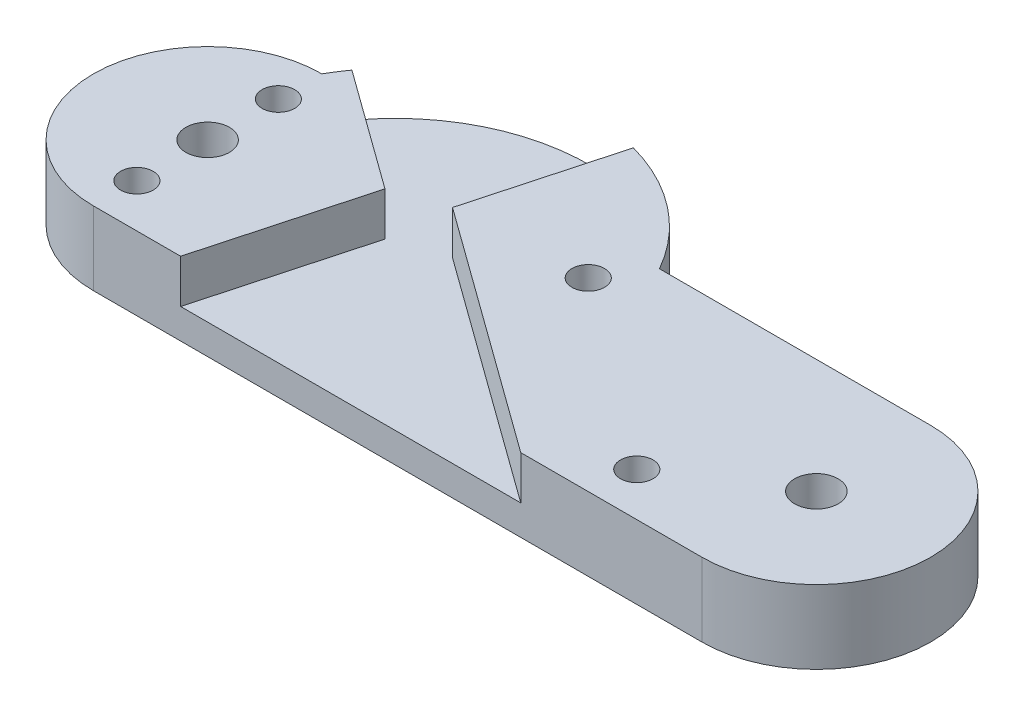
ISO-10303-21;
HEADER;
FILE_DESCRIPTION(('STEP AP214'),'2;1');
FILE_NAME('part.step','',(''),(''),'','','');
FILE_SCHEMA(('AUTOMOTIVE_DESIGN { 1 0 10303 214 1 1 1 1 }'));
ENDSEC;
DATA;
#1=APPLICATION_CONTEXT('core data for automotive mechanical design processes');
#2=APPLICATION_PROTOCOL_DEFINITION('international standard','automotive_design',2000,#1);
#3=PRODUCT_CONTEXT('',#1,'mechanical');
#4=PRODUCT('Part','Part','',(#3));
#5=PRODUCT_RELATED_PRODUCT_CATEGORY('part','',(#4));
#6=PRODUCT_DEFINITION_FORMATION('','',#4);
#7=PRODUCT_DEFINITION_CONTEXT('part definition',#1,'design');
#8=PRODUCT_DEFINITION('design','',#6,#7);
#9=PRODUCT_DEFINITION_SHAPE('','',#8);
#10=(LENGTH_UNIT() NAMED_UNIT(*) SI_UNIT(.MILLI.,.METRE.));
#11=(NAMED_UNIT(*) PLANE_ANGLE_UNIT() SI_UNIT($,.RADIAN.));
#12=(NAMED_UNIT(*) SI_UNIT($,.STERADIAN.) SOLID_ANGLE_UNIT());
#13=UNCERTAINTY_MEASURE_WITH_UNIT(LENGTH_MEASURE(1.E-05),#10,'distance_accuracy_value','');
#14=(GEOMETRIC_REPRESENTATION_CONTEXT(3) GLOBAL_UNCERTAINTY_ASSIGNED_CONTEXT((#13)) GLOBAL_UNIT_ASSIGNED_CONTEXT((#10,
#11,#12)) REPRESENTATION_CONTEXT('',''));
#15=CARTESIAN_POINT('',(0.,0.,0.));
#16=DIRECTION('',(0.,0.,1.));
#17=DIRECTION('',(1.,0.,0.));
#18=AXIS2_PLACEMENT_3D('',#15,#16,#17);
#19=CARTESIAN_POINT('',(0.,2.,0.));
#20=DIRECTION('',(0.,-1.,0.));
#21=DIRECTION('',(0.,0.,-1.));
#22=AXIS2_PLACEMENT_3D('',#19,#20,#21);
#23=PLANE('',#22);
#24=CARTESIAN_POINT('',(-55.9305382801715,2.,-6.5003992165423));
#25=DIRECTION('',(0.,-1.,0.));
#26=DIRECTION('',(0.,0.,-1.));
#27=AXIS2_PLACEMENT_3D('',#24,#25,#26);
#28=CIRCLE('',#27,1.5);
#29=CARTESIAN_POINT('',(-55.9305382801715,2.,-8.00039921654231));
#30=VERTEX_POINT('',#29);
#31=EDGE_CURVE('E196',#30,#30,#28,.F.);
#32=ORIENTED_EDGE('',*,*,#31,.F.);
#33=EDGE_LOOP('',(#32));
#34=FACE_BOUND('',#33,.T.);
#35=CARTESIAN_POINT('',(-55.9305382801715,2.,0.));
#36=DIRECTION('',(0.,-1.,0.));
#37=DIRECTION('',(0.,0.,-1.));
#38=AXIS2_PLACEMENT_3D('',#35,#36,#37);
#39=CIRCLE('',#38,2.);
#40=CARTESIAN_POINT('',(-55.9305382801715,2.,-2.));
#41=VERTEX_POINT('',#40);
#42=EDGE_CURVE('E11',#41,#41,#39,.T.);
#43=ORIENTED_EDGE('',*,*,#42,.T.);
#44=EDGE_LOOP('',(#43));
#45=FACE_BOUND('',#44,.T.);
#46=CARTESIAN_POINT('',(-55.9305382801715,2.,0.));
#47=DIRECTION('',(0.,-1.,0.));
#48=DIRECTION('',(0.,0.,-1.));
#49=AXIS2_PLACEMENT_3D('',#46,#47,#48);
#50=CIRCLE('',#49,10.5003992165423);
#51=CARTESIAN_POINT('',(-55.9305382801715,2.,10.5003992165423));
#52=VERTEX_POINT('',#51);
#53=CARTESIAN_POINT('',(-55.9305382801715,2.,-10.5003992165423));
#54=VERTEX_POINT('',#53);
#55=EDGE_CURVE('E167',#52,#54,#50,.T.);
#56=ORIENTED_EDGE('',*,*,#55,.F.);
#57=DIRECTION('',(-1.,0.,0.));
#58=VECTOR('',#57,1.);
#59=CARTESIAN_POINT('',(0.,2.,10.5003992165423));
#60=LINE('',#59,#58);
#61=CARTESIAN_POINT('',(-47.9106890267398,2.,10.5003992165423));
#62=VERTEX_POINT('',#61);
#63=EDGE_CURVE('E190',#62,#52,#60,.T.);
#64=ORIENTED_EDGE('',*,*,#63,.F.);
#65=DIRECTION('',(-0.263153614525289,0.,0.964753945398657));
#66=VECTOR('',#65,1.);
#67=CARTESIAN_POINT('',(-43.8872651072943,2.,-4.24997427651618));
#68=LINE('',#67,#66);
#69=CARTESIAN_POINT('',(-43.8872651072943,2.,-4.24997427651618));
#70=VERTEX_POINT('',#69);
#71=EDGE_CURVE('E533',#70,#62,#68,.T.);
#72=ORIENTED_EDGE('',*,*,#71,.F.);
#73=DIRECTION('',(0.810372315489383,0.,0.585915275691269));
#74=VECTOR('',#73,1.);
#75=CARTESIAN_POINT('',(-43.8872651072943,2.,-4.24997427651618));
#76=LINE('',#75,#74);
#77=CARTESIAN_POINT('',(-54.8543825263999,2.,-12.1794179449777));
#78=VERTEX_POINT('',#77);
#79=EDGE_CURVE('E550',#78,#70,#76,.T.);
#80=ORIENTED_EDGE('',*,*,#79,.F.);
#81=CARTESIAN_POINT('',(-40.4241193156667,2.,-1.7460511013579));
#82=DIRECTION('',(0.,-1.,0.));
#83=DIRECTION('',(0.,0.,-1.));
#84=AXIS2_PLACEMENT_3D('',#81,#82,#83);
#85=CIRCLE('',#84,17.8069548217708);
#86=EDGE_CURVE('E64',#54,#78,#85,.T.);
#87=ORIENTED_EDGE('',*,*,#86,.F.);
#88=EDGE_LOOP('',(#56,#64,#72,#80,#87));
#89=FACE_BOUND('',#88,.T.);
#90=CARTESIAN_POINT('',(-55.9305382801715,2.,6.5003992165423));
#91=DIRECTION('',(0.,-1.,0.));
#92=DIRECTION('',(0.,0.,-1.));
#93=AXIS2_PLACEMENT_3D('',#90,#91,#92);
#94=CIRCLE('',#93,1.5);
#95=CARTESIAN_POINT('',(-55.9305382801715,2.,5.0003992165423));
#96=VERTEX_POINT('',#95);
#97=EDGE_CURVE('E202',#96,#96,#94,.F.);
#98=ORIENTED_EDGE('',*,*,#97,.F.);
#99=EDGE_LOOP('',(#98));
#100=FACE_BOUND('',#99,.T.);
#101=ADVANCED_FACE('F40',(#34,#45,#89,#100),#23,.F.);
#102=CARTESIAN_POINT('',(-41.5933955268113,2.,-5.05946240908561));
#103=DIRECTION('',(0.,1.,0.));
#104=DIRECTION('',(0.,0.,1.));
#105=AXIS2_PLACEMENT_3D('',#102,#103,#104);
#106=PLANE('',#105);
#107=CARTESIAN_POINT('',(0.,2.,0.));
#108=DIRECTION('',(0.,1.,0.));
#109=DIRECTION('',(0.,0.,1.));
#110=AXIS2_PLACEMENT_3D('',#107,#108,#109);
#111=CIRCLE('',#110,2.);
#112=CARTESIAN_POINT('',(0.,2.,2.));
#113=VERTEX_POINT('',#112);
#114=EDGE_CURVE('E142',#113,#113,#111,.T.);
#115=ORIENTED_EDGE('',*,*,#114,.F.);
#116=EDGE_LOOP('',(#115));
#117=FACE_BOUND('',#116,.T.);
#118=DIRECTION('',(1.,0.,0.));
#119=VECTOR('',#118,1.);
#120=CARTESIAN_POINT('',(-12.458850175581,2.,-10.5003992165423));
#121=LINE('',#120,#119);
#122=CARTESIAN_POINT('',(-24.917700351162,2.,-10.5003992165423));
#123=VERTEX_POINT('',#122);
#124=CARTESIAN_POINT('',(0.,2.,-10.5003992165423));
#125=VERTEX_POINT('',#124);
#126=EDGE_CURVE('E56',#123,#125,#121,.T.);
#127=ORIENTED_EDGE('',*,*,#126,.F.);
#128=CARTESIAN_POINT('',(-35.7381547906292,2.,-18.9253810211969));
#129=VERTEX_POINT('',#128);
#130=EDGE_CURVE('E193',#129,#123,#85,.T.);
#131=ORIENTED_EDGE('',*,*,#130,.F.);
#132=DIRECTION('',(0.263153614525288,0.,-0.964753945398658));
#133=VECTOR('',#132,1.);
#134=CARTESIAN_POINT('',(-35.7518279113757,2.,-18.8752536565782));
#135=LINE('',#134,#133);
#136=CARTESIAN_POINT('',(-39.2995259463282,2.,-5.86895054165502));
#137=VERTEX_POINT('',#136);
#138=EDGE_CURVE('E547',#137,#129,#135,.T.);
#139=ORIENTED_EDGE('',*,*,#138,.F.);
#140=DIRECTION('',(-0.810372315489383,0.,-0.585915275691269));
#141=VECTOR('',#140,1.);
#142=CARTESIAN_POINT('',(26.6452391554762,2.,41.8104240945407));
#143=LINE('',#142,#141);
#144=CARTESIAN_POINT('',(-16.659276720951,2.,10.5003992165423));
#145=VERTEX_POINT('',#144);
#146=EDGE_CURVE('E528',#145,#137,#143,.T.);
#147=ORIENTED_EDGE('',*,*,#146,.F.);
#148=DIRECTION('',(-1.,0.,0.));
#149=VECTOR('',#148,1.);
#150=CARTESIAN_POINT('',(-4.6195471407067,2.,10.5003992165423));
#151=LINE('',#150,#149);
#152=CARTESIAN_POINT('',(0.,2.,10.5003992165423));
#153=VERTEX_POINT('',#152);
#154=EDGE_CURVE('E128',#153,#145,#151,.T.);
#155=ORIENTED_EDGE('',*,*,#154,.F.);
#156=CARTESIAN_POINT('',(0.,2.,0.));
#157=DIRECTION('',(0.,1.,0.));
#158=DIRECTION('',(0.,0.,1.));
#159=AXIS2_PLACEMENT_3D('',#156,#157,#158);
#160=CIRCLE('',#159,10.5003992165423);
#161=EDGE_CURVE('E124',#125,#153,#160,.F.);
#162=ORIENTED_EDGE('',*,*,#161,.F.);
#163=EDGE_LOOP('',(#127,#131,#139,#147,#155,#162));
#164=FACE_BOUND('',#163,.T.);
#165=CARTESIAN_POINT('',(-10.,2.,6.5003992165423));
#166=DIRECTION('',(0.,-1.,0.));
#167=DIRECTION('',(0.,0.,-1.));
#168=AXIS2_PLACEMENT_3D('',#165,#166,#167);
#169=CIRCLE('',#168,1.5);
#170=CARTESIAN_POINT('',(-10.,2.,5.0003992165423));
#171=VERTEX_POINT('',#170);
#172=EDGE_CURVE('E205',#171,#171,#169,.F.);
#173=ORIENTED_EDGE('',*,*,#172,.F.);
#174=EDGE_LOOP('',(#173));
#175=FACE_BOUND('',#174,.T.);
#176=CARTESIAN_POINT('',(-27.4615510728353,2.,-6.5003992165423));
#177=DIRECTION('',(0.,-1.,0.));
#178=DIRECTION('',(0.,0.,-1.));
#179=AXIS2_PLACEMENT_3D('',#176,#177,#178);
#180=CIRCLE('',#179,1.5);
#181=CARTESIAN_POINT('',(-27.4615510728353,2.,-8.00039921654231));
#182=VERTEX_POINT('',#181);
#183=EDGE_CURVE('E43',#182,#182,#180,.F.);
#184=ORIENTED_EDGE('',*,*,#183,.F.);
#185=EDGE_LOOP('',(#184));
#186=FACE_BOUND('',#185,.T.);
#187=ADVANCED_FACE('F125',(#117,#164,#175,#186),#106,.T.);
#188=CARTESIAN_POINT('',(-55.9305382801715,-1.55,6.5003992165423));
#189=DIRECTION('',(0.,-1.,0.));
#190=DIRECTION('',(0.,0.,-1.));
#191=AXIS2_PLACEMENT_3D('',#188,#189,#190);
#192=CYLINDRICAL_SURFACE('',#191,2.75);
#193=CARTESIAN_POINT('',(-55.9305382801715,-1.55,6.5003992165423));
#194=DIRECTION('',(0.,-1.,0.));
#195=DIRECTION('',(0.,0.,-1.));
#196=AXIS2_PLACEMENT_3D('',#193,#194,#195);
#197=CIRCLE('',#196,2.75);
#198=CARTESIAN_POINT('',(-55.9305382801715,-1.55,3.7503992165423));
#199=VERTEX_POINT('',#198);
#200=EDGE_CURVE('E173',#199,#199,#197,.T.);
#201=ORIENTED_EDGE('',*,*,#200,.F.);
#202=EDGE_LOOP('',(#201));
#203=FACE_BOUND('',#202,.T.);
#204=CARTESIAN_POINT('',(-55.9305382801715,-4.75,6.5003992165423));
#205=DIRECTION('',(0.,-1.,0.));
#206=DIRECTION('',(0.,0.,-1.));
#207=AXIS2_PLACEMENT_3D('',#204,#205,#206);
#208=CIRCLE('',#207,2.75);
#209=CARTESIAN_POINT('',(-55.9305382801715,-4.75,3.7503992165423));
#210=VERTEX_POINT('',#209);
#211=EDGE_CURVE('E506',#210,#210,#208,.T.);
#212=ORIENTED_EDGE('',*,*,#211,.T.);
#213=EDGE_LOOP('',(#212));
#214=FACE_BOUND('',#213,.T.);
#215=ADVANCED_FACE('F218',(#203,#214),#192,.F.);
#216=CARTESIAN_POINT('',(-55.9305382801715,-1.55,-6.5003992165423));
#217=DIRECTION('',(0.,-1.,0.));
#218=DIRECTION('',(0.,0.,-1.));
#219=AXIS2_PLACEMENT_3D('',#216,#217,#218);
#220=CYLINDRICAL_SURFACE('',#219,2.75);
#221=CARTESIAN_POINT('',(-55.9305382801715,-1.55,-6.5003992165423));
#222=DIRECTION('',(0.,-1.,0.));
#223=DIRECTION('',(0.,0.,-1.));
#224=AXIS2_PLACEMENT_3D('',#221,#222,#223);
#225=CIRCLE('',#224,2.75);
#226=CARTESIAN_POINT('',(-55.9305382801715,-1.55,-9.2503992165423));
#227=VERTEX_POINT('',#226);
#228=EDGE_CURVE('E510',#227,#227,#225,.T.);
#229=ORIENTED_EDGE('',*,*,#228,.F.);
#230=EDGE_LOOP('',(#229));
#231=FACE_BOUND('',#230,.T.);
#232=CARTESIAN_POINT('',(-55.9305382801715,-4.75,-6.5003992165423));
#233=DIRECTION('',(0.,-1.,0.));
#234=DIRECTION('',(0.,0.,-1.));
#235=AXIS2_PLACEMENT_3D('',#232,#233,#234);
#236=CIRCLE('',#235,2.75);
#237=CARTESIAN_POINT('',(-55.9305382801715,-4.75,-9.2503992165423));
#238=VERTEX_POINT('',#237);
#239=EDGE_CURVE('E608',#238,#238,#236,.T.);
#240=ORIENTED_EDGE('',*,*,#239,.T.);
#241=EDGE_LOOP('',(#240));
#242=FACE_BOUND('',#241,.T.);
#243=ADVANCED_FACE('F225',(#231,#242),#220,.F.);
#244=CARTESIAN_POINT('',(-27.4615510728353,-1.55,-6.5003992165423));
#245=DIRECTION('',(0.,-1.,0.));
#246=DIRECTION('',(0.,0.,-1.));
#247=AXIS2_PLACEMENT_3D('',#244,#245,#246);
#248=CYLINDRICAL_SURFACE('',#247,2.75);
#249=CARTESIAN_POINT('',(-27.4615510728353,-1.55,-6.5003992165423));
#250=DIRECTION('',(0.,-1.,0.));
#251=DIRECTION('',(0.,0.,-1.));
#252=AXIS2_PLACEMENT_3D('',#249,#250,#251);
#253=CIRCLE('',#252,2.75);
#254=CARTESIAN_POINT('',(-27.4615510728353,-1.55,-9.2503992165423));
#255=VERTEX_POINT('',#254);
#256=EDGE_CURVE('E612',#255,#255,#253,.T.);
#257=ORIENTED_EDGE('',*,*,#256,.F.);
#258=EDGE_LOOP('',(#257));
#259=FACE_BOUND('',#258,.T.);
#260=CARTESIAN_POINT('',(-27.4615510728353,-4.75,-6.5003992165423));
#261=DIRECTION('',(0.,-1.,0.));
#262=DIRECTION('',(0.,0.,-1.));
#263=AXIS2_PLACEMENT_3D('',#260,#261,#262);
#264=CIRCLE('',#263,2.75);
#265=CARTESIAN_POINT('',(-27.4615510728353,-4.75,-9.2503992165423));
#266=VERTEX_POINT('',#265);
#267=EDGE_CURVE('E499',#266,#266,#264,.T.);
#268=ORIENTED_EDGE('',*,*,#267,.T.);
#269=EDGE_LOOP('',(#268));
#270=FACE_BOUND('',#269,.T.);
#271=ADVANCED_FACE('F396',(#259,#270),#248,.F.);
#272=CARTESIAN_POINT('',(-10.,-1.55,6.5003992165423));
#273=DIRECTION('',(0.,-1.,0.));
#274=DIRECTION('',(0.,0.,-1.));
#275=AXIS2_PLACEMENT_3D('',#272,#273,#274);
#276=CYLINDRICAL_SURFACE('',#275,2.75);
#277=CARTESIAN_POINT('',(-10.,-1.55,6.5003992165423));
#278=DIRECTION('',(0.,-1.,0.));
#279=DIRECTION('',(0.,0.,-1.));
#280=AXIS2_PLACEMENT_3D('',#277,#278,#279);
#281=CIRCLE('',#280,2.75);
#282=CARTESIAN_POINT('',(-10.,-1.55,3.7503992165423));
#283=VERTEX_POINT('',#282);
#284=EDGE_CURVE('E493',#283,#283,#281,.T.);
#285=ORIENTED_EDGE('',*,*,#284,.F.);
#286=EDGE_LOOP('',(#285));
#287=FACE_BOUND('',#286,.T.);
#288=CARTESIAN_POINT('',(-10.,-4.75,6.5003992165423));
#289=DIRECTION('',(0.,-1.,0.));
#290=DIRECTION('',(0.,0.,-1.));
#291=AXIS2_PLACEMENT_3D('',#288,#289,#290);
#292=CIRCLE('',#291,2.75);
#293=CARTESIAN_POINT('',(-10.,-4.75,3.7503992165423));
#294=VERTEX_POINT('',#293);
#295=EDGE_CURVE('E189',#294,#294,#292,.T.);
#296=ORIENTED_EDGE('',*,*,#295,.T.);
#297=EDGE_LOOP('',(#296));
#298=FACE_BOUND('',#297,.T.);
#299=ADVANCED_FACE('F267',(#287,#298),#276,.F.);
#300=CARTESIAN_POINT('',(-35.7518279113757,-2.,-18.8752536565782));
#301=DIRECTION('',(0.964753945398658,0.,0.263153614525288));
#302=DIRECTION('',(0.263153614525288,0.,-0.964753945398658));
#303=AXIS2_PLACEMENT_3D('',#300,#301,#302);
#304=PLANE('',#303);
#305=DIRECTION('',(0.263153614525288,0.,-0.964753945398658));
#306=VECTOR('',#305,1.);
#307=CARTESIAN_POINT('',(-35.7518279113757,-2.,-18.8752536565782));
#308=LINE('',#307,#306);
#309=CARTESIAN_POINT('',(-39.2995259463282,-2.,-5.86895054165502));
#310=VERTEX_POINT('',#309);
#311=CARTESIAN_POINT('',(-35.7381547906292,-2.,-18.9253810211969));
#312=VERTEX_POINT('',#311);
#313=EDGE_CURVE('E532',#310,#312,#308,.T.);
#314=ORIENTED_EDGE('',*,*,#313,.F.);
#315=DIRECTION('',(0.,1.,0.));
#316=VECTOR('',#315,1.);
#317=CARTESIAN_POINT('',(-39.2995259463282,-2.,-5.86895054165502));
#318=LINE('',#317,#316);
#319=EDGE_CURVE('E543',#310,#137,#318,.T.);
#320=ORIENTED_EDGE('',*,*,#319,.T.);
#321=ORIENTED_EDGE('',*,*,#138,.T.);
#322=DIRECTION('',(0.,1.,0.));
#323=VECTOR('',#322,1.);
#324=CARTESIAN_POINT('',(-35.7381547906292,-2.,-18.9253810211969));
#325=LINE('',#324,#323);
#326=EDGE_CURVE('E514',#312,#129,#325,.T.);
#327=ORIENTED_EDGE('',*,*,#326,.F.);
#328=EDGE_LOOP('',(#314,#320,#321,#327));
#329=FACE_BOUND('',#328,.T.);
#330=ADVANCED_FACE('F248',(#329),#304,.F.);
#331=CARTESIAN_POINT('',(-40.4241193156667,37.0570550282,-1.7460511013579));
#332=DIRECTION('',(0.,-1.,0.));
#333=DIRECTION('',(0.,0.,-1.));
#334=AXIS2_PLACEMENT_3D('',#331,#332,#333);
#335=CYLINDRICAL_SURFACE('',#334,17.8069548217708);
#336=ORIENTED_EDGE('',*,*,#326,.T.);
#337=ORIENTED_EDGE('',*,*,#130,.T.);
#338=DIRECTION('',(0.,-1.,0.));
#339=VECTOR('',#338,1.);
#340=CARTESIAN_POINT('',(-24.917700351162,37.0570550282,-10.5003992165423));
#341=LINE('',#340,#339);
#342=CARTESIAN_POINT('',(-24.917700351162,-4.75,-10.5003992165423));
#343=VERTEX_POINT('',#342);
#344=EDGE_CURVE('E140',#123,#343,#341,.T.);
#345=ORIENTED_EDGE('',*,*,#344,.T.);
#346=CARTESIAN_POINT('',(-40.4241193156667,-4.75,-1.7460511013579));
#347=DIRECTION('',(0.,1.,0.));
#348=DIRECTION('',(0.,0.,1.));
#349=AXIS2_PLACEMENT_3D('',#346,#347,#348);
#350=CIRCLE('',#349,17.8069548217708);
#351=CARTESIAN_POINT('',(-55.9305382801715,-4.75,-10.5003992165423));
#352=VERTEX_POINT('',#351);
#353=EDGE_CURVE('E519',#352,#343,#350,.F.);
#354=ORIENTED_EDGE('',*,*,#353,.F.);
#355=DIRECTION('',(0.,-1.,0.));
#356=VECTOR('',#355,1.);
#357=CARTESIAN_POINT('',(-55.9305382801715,4.75,-10.5003992165423));
#358=LINE('',#357,#356);
#359=EDGE_CURVE('E150',#54,#352,#358,.T.);
#360=ORIENTED_EDGE('',*,*,#359,.F.);
#361=ORIENTED_EDGE('',*,*,#86,.T.);
#362=DIRECTION('',(0.,1.,0.));
#363=VECTOR('',#362,1.);
#364=CARTESIAN_POINT('',(-54.8543825263999,-2.,-12.1794179449777));
#365=LINE('',#364,#363);
#366=CARTESIAN_POINT('',(-54.8543825263999,-2.,-12.1794179449777));
#367=VERTEX_POINT('',#366);
#368=EDGE_CURVE('E515',#367,#78,#365,.T.);
#369=ORIENTED_EDGE('',*,*,#368,.F.);
#370=CARTESIAN_POINT('',(-40.4241193156667,-2.,-1.7460511013579));
#371=DIRECTION('',(0.,1.,0.));
#372=DIRECTION('',(0.,0.,1.));
#373=AXIS2_PLACEMENT_3D('',#370,#371,#372);
#374=CIRCLE('',#373,17.8069548217708);
#375=EDGE_CURVE('E185',#312,#367,#374,.T.);
#376=ORIENTED_EDGE('',*,*,#375,.F.);
#377=EDGE_LOOP('',(#336,#337,#345,#354,#360,#361,#369,#376));
#378=FACE_BOUND('',#377,.T.);
#379=ADVANCED_FACE('F244',(#378),#335,.T.);
#380=CARTESIAN_POINT('',(-55.9305382801715,4.75,0.));
#381=DIRECTION('',(0.,-1.,0.));
#382=DIRECTION('',(0.,0.,-1.));
#383=AXIS2_PLACEMENT_3D('',#380,#381,#382);
#384=CYLINDRICAL_SURFACE('',#383,10.5003992165423);
#385=DIRECTION('',(0.,-1.,0.));
#386=VECTOR('',#385,1.);
#387=CARTESIAN_POINT('',(-55.9305382801715,4.75,10.5003992165423));
#388=LINE('',#387,#386);
#389=CARTESIAN_POINT('',(-55.9305382801715,-4.75,10.5003992165423));
#390=VERTEX_POINT('',#389);
#391=EDGE_CURVE('E157',#52,#390,#388,.T.);
#392=ORIENTED_EDGE('',*,*,#391,.F.);
#393=ORIENTED_EDGE('',*,*,#55,.T.);
#394=ORIENTED_EDGE('',*,*,#359,.T.);
#395=CARTESIAN_POINT('',(-55.9305382801715,-4.75,0.));
#396=DIRECTION('',(0.,1.,0.));
#397=DIRECTION('',(0.,0.,1.));
#398=AXIS2_PLACEMENT_3D('',#395,#396,#397);
#399=CIRCLE('',#398,10.5003992165423);
#400=EDGE_CURVE('E575',#352,#390,#399,.T.);
#401=ORIENTED_EDGE('',*,*,#400,.T.);
#402=EDGE_LOOP('',(#392,#393,#394,#401));
#403=FACE_BOUND('',#402,.T.);
#404=ADVANCED_FACE('F247',(#403),#384,.T.);
#405=CARTESIAN_POINT('',(-43.8872651072943,-2.,-4.24997427651618));
#406=DIRECTION('',(-0.964753945398657,0.,-0.263153614525289));
#407=DIRECTION('',(-0.263153614525289,0.,0.964753945398657));
#408=AXIS2_PLACEMENT_3D('',#405,#406,#407);
#409=PLANE('',#408);
#410=DIRECTION('',(-0.263153614525289,0.,0.964753945398657));
#411=VECTOR('',#410,1.);
#412=CARTESIAN_POINT('',(-43.8872651072943,-2.,-4.24997427651618));
#413=LINE('',#412,#411);
#414=CARTESIAN_POINT('',(-43.8872651072943,-2.,-4.24997427651618));
#415=VERTEX_POINT('',#414);
#416=CARTESIAN_POINT('',(-47.9106890267398,-2.,10.5003992165423));
#417=VERTEX_POINT('',#416);
#418=EDGE_CURVE('E539',#415,#417,#413,.T.);
#419=ORIENTED_EDGE('',*,*,#418,.F.);
#420=DIRECTION('',(0.,1.,0.));
#421=VECTOR('',#420,1.);
#422=CARTESIAN_POINT('',(-43.8872651072943,-2.,-4.24997427651618));
#423=LINE('',#422,#421);
#424=EDGE_CURVE('E555',#415,#70,#423,.T.);
#425=ORIENTED_EDGE('',*,*,#424,.T.);
#426=ORIENTED_EDGE('',*,*,#71,.T.);
#427=DIRECTION('',(0.,1.,0.));
#428=VECTOR('',#427,1.);
#429=CARTESIAN_POINT('',(-47.9106890267398,4.75,10.5003992165423));
#430=LINE('',#429,#428);
#431=EDGE_CURVE('E149',#417,#62,#430,.T.);
#432=ORIENTED_EDGE('',*,*,#431,.F.);
#433=EDGE_LOOP('',(#419,#425,#426,#432));
#434=FACE_BOUND('',#433,.T.);
#435=ADVANCED_FACE('F254',(#434),#409,.F.);
#436=CARTESIAN_POINT('',(-41.5933955268113,-2.,-5.05946240908561));
#437=DIRECTION('',(0.,1.,0.));
#438=DIRECTION('',(0.,0.,1.));
#439=AXIS2_PLACEMENT_3D('',#436,#437,#438);
#440=PLANE('',#439);
#441=ORIENTED_EDGE('',*,*,#313,.T.);
#442=ORIENTED_EDGE('',*,*,#375,.T.);
#443=DIRECTION('',(0.810372315489383,0.,0.585915275691269));
#444=VECTOR('',#443,1.);
#445=CARTESIAN_POINT('',(-43.8872651072943,-2.,-4.24997427651618));
#446=LINE('',#445,#444);
#447=EDGE_CURVE('E536',#367,#415,#446,.T.);
#448=ORIENTED_EDGE('',*,*,#447,.T.);
#449=ORIENTED_EDGE('',*,*,#418,.T.);
#450=DIRECTION('',(1.,0.,0.));
#451=VECTOR('',#450,1.);
#452=CARTESIAN_POINT('',(0.,-2.,10.5003992165423));
#453=LINE('',#452,#451);
#454=CARTESIAN_POINT('',(-16.659276720951,-2.,10.5003992165423));
#455=VERTEX_POINT('',#454);
#456=EDGE_CURVE('E164',#417,#455,#453,.T.);
#457=ORIENTED_EDGE('',*,*,#456,.T.);
#458=DIRECTION('',(-0.810372315489383,0.,-0.585915275691269));
#459=VECTOR('',#458,1.);
#460=CARTESIAN_POINT('',(26.6452391554762,-2.,41.8104240945407));
#461=LINE('',#460,#459);
#462=EDGE_CURVE('E529',#455,#310,#461,.T.);
#463=ORIENTED_EDGE('',*,*,#462,.T.);
#464=EDGE_LOOP('',(#441,#442,#448,#449,#457,#463));
#465=FACE_BOUND('',#464,.T.);
#466=ADVANCED_FACE('F250',(#465),#440,.T.);
#467=CARTESIAN_POINT('',(26.6452391554762,-2.,41.8104240945407));
#468=DIRECTION('',(0.585915275691269,0.,-0.810372315489383));
#469=DIRECTION('',(-0.810372315489383,0.,-0.585915275691269));
#470=AXIS2_PLACEMENT_3D('',#467,#468,#469);
#471=PLANE('',#470);
#472=ORIENTED_EDGE('',*,*,#146,.T.);
#473=ORIENTED_EDGE('',*,*,#319,.F.);
#474=ORIENTED_EDGE('',*,*,#462,.F.);
#475=DIRECTION('',(0.,-1.,0.));
#476=VECTOR('',#475,1.);
#477=CARTESIAN_POINT('',(-16.659276720951,4.75,10.5003992165423));
#478=LINE('',#477,#476);
#479=EDGE_CURVE('E155',#145,#455,#478,.T.);
#480=ORIENTED_EDGE('',*,*,#479,.F.);
#481=EDGE_LOOP('',(#472,#473,#474,#480));
#482=FACE_BOUND('',#481,.T.);
#483=ADVANCED_FACE('F253',(#482),#471,.F.);
#484=CARTESIAN_POINT('',(0.,4.75,-10.5003992165423));
#485=DIRECTION('',(0.,0.,1.));
#486=DIRECTION('',(1.,0.,0.));
#487=AXIS2_PLACEMENT_3D('',#484,#485,#486);
#488=PLANE('',#487);
#489=ORIENTED_EDGE('',*,*,#344,.F.);
#490=ORIENTED_EDGE('',*,*,#126,.T.);
#491=DIRECTION('',(0.,-1.,0.));
#492=VECTOR('',#491,1.);
#493=CARTESIAN_POINT('',(0.,4.75,-10.5003992165423));
#494=LINE('',#493,#492);
#495=CARTESIAN_POINT('',(0.,-4.75,-10.5003992165423));
#496=VERTEX_POINT('',#495);
#497=EDGE_CURVE('E138',#125,#496,#494,.T.);
#498=ORIENTED_EDGE('',*,*,#497,.T.);
#499=DIRECTION('',(-1.,0.,0.));
#500=VECTOR('',#499,1.);
#501=CARTESIAN_POINT('',(0.,-4.75,-10.5003992165423));
#502=LINE('',#501,#500);
#503=EDGE_CURVE('E572',#496,#343,#502,.T.);
#504=ORIENTED_EDGE('',*,*,#503,.T.);
#505=EDGE_LOOP('',(#489,#490,#498,#504));
#506=FACE_BOUND('',#505,.T.);
#507=ADVANCED_FACE('F136',(#506),#488,.F.);
#508=CARTESIAN_POINT('',(0.,-4.75,0.));
#509=DIRECTION('',(0.,1.,0.));
#510=DIRECTION('',(0.,0.,1.));
#511=AXIS2_PLACEMENT_3D('',#508,#509,#510);
#512=PLANE('',#511);
#513=ORIENTED_EDGE('',*,*,#295,.F.);
#514=EDGE_LOOP('',(#513));
#515=FACE_BOUND('',#514,.T.);
#516=ORIENTED_EDGE('',*,*,#267,.F.);
#517=EDGE_LOOP('',(#516));
#518=FACE_BOUND('',#517,.T.);
#519=ORIENTED_EDGE('',*,*,#239,.F.);
#520=EDGE_LOOP('',(#519));
#521=FACE_BOUND('',#520,.T.);
#522=ORIENTED_EDGE('',*,*,#211,.F.);
#523=EDGE_LOOP('',(#522));
#524=FACE_BOUND('',#523,.T.);
#525=CARTESIAN_POINT('',(0.,-4.75,0.));
#526=DIRECTION('',(0.,1.,0.));
#527=DIRECTION('',(0.,0.,1.));
#528=AXIS2_PLACEMENT_3D('',#525,#526,#527);
#529=CIRCLE('',#528,10.5003992165423);
#530=CARTESIAN_POINT('',(0.,-4.75,10.5003992165423));
#531=VERTEX_POINT('',#530);
#532=EDGE_CURVE('E147',#531,#496,#529,.T.);
#533=ORIENTED_EDGE('',*,*,#532,.F.);
#534=DIRECTION('',(1.,0.,0.));
#535=VECTOR('',#534,1.);
#536=CARTESIAN_POINT('',(0.,-4.75,10.5003992165423));
#537=LINE('',#536,#535);
#538=EDGE_CURVE('E579',#390,#531,#537,.T.);
#539=ORIENTED_EDGE('',*,*,#538,.F.);
#540=ORIENTED_EDGE('',*,*,#400,.F.);
#541=ORIENTED_EDGE('',*,*,#353,.T.);
#542=ORIENTED_EDGE('',*,*,#503,.F.);
#543=EDGE_LOOP('',(#533,#539,#540,#541,#542));
#544=FACE_BOUND('',#543,.T.);
#545=CARTESIAN_POINT('',(0.,-4.75,0.));
#546=DIRECTION('',(0.,1.,0.));
#547=DIRECTION('',(0.,0.,1.));
#548=AXIS2_PLACEMENT_3D('',#545,#546,#547);
#549=CIRCLE('',#548,2.);
#550=CARTESIAN_POINT('',(0.,-4.75,2.));
#551=VERTEX_POINT('',#550);
#552=EDGE_CURVE('E566',#551,#551,#549,.T.);
#553=ORIENTED_EDGE('',*,*,#552,.T.);
#554=EDGE_LOOP('',(#553));
#555=FACE_BOUND('',#554,.T.);
#556=CARTESIAN_POINT('',(-55.9305382801715,-4.75,0.));
#557=DIRECTION('',(0.,1.,0.));
#558=DIRECTION('',(0.,0.,1.));
#559=AXIS2_PLACEMENT_3D('',#556,#557,#558);
#560=CIRCLE('',#559,2.);
#561=CARTESIAN_POINT('',(-55.9305382801715,-4.75,2.));
#562=VERTEX_POINT('',#561);
#563=EDGE_CURVE('E559',#562,#562,#560,.T.);
#564=ORIENTED_EDGE('',*,*,#563,.T.);
#565=EDGE_LOOP('',(#564));
#566=FACE_BOUND('',#565,.T.);
#567=ADVANCED_FACE('F279',(#515,#518,#521,#524,#544,#555,#566),#512,.F.);
#568=CARTESIAN_POINT('',(0.,4.75,10.5003992165423));
#569=DIRECTION('',(0.,0.,-1.));
#570=DIRECTION('',(-1.,0.,0.));
#571=AXIS2_PLACEMENT_3D('',#568,#569,#570);
#572=PLANE('',#571);
#573=ORIENTED_EDGE('',*,*,#154,.T.);
#574=ORIENTED_EDGE('',*,*,#479,.T.);
#575=ORIENTED_EDGE('',*,*,#456,.F.);
#576=ORIENTED_EDGE('',*,*,#431,.T.);
#577=ORIENTED_EDGE('',*,*,#63,.T.);
#578=ORIENTED_EDGE('',*,*,#391,.T.);
#579=ORIENTED_EDGE('',*,*,#538,.T.);
#580=DIRECTION('',(0.,-1.,0.));
#581=VECTOR('',#580,1.);
#582=CARTESIAN_POINT('',(0.,4.75,10.5003992165423));
#583=LINE('',#582,#581);
#584=EDGE_CURVE('E583',#153,#531,#583,.T.);
#585=ORIENTED_EDGE('',*,*,#584,.F.);
#586=EDGE_LOOP('',(#573,#574,#575,#576,#577,#578,#579,#585));
#587=FACE_BOUND('',#586,.T.);
#588=ADVANCED_FACE('F282',(#587),#572,.F.);
#589=CARTESIAN_POINT('',(0.,4.75,0.));
#590=DIRECTION('',(0.,-1.,0.));
#591=DIRECTION('',(0.,0.,-1.));
#592=AXIS2_PLACEMENT_3D('',#589,#590,#591);
#593=CYLINDRICAL_SURFACE('',#592,10.5003992165423);
#594=ORIENTED_EDGE('',*,*,#161,.T.);
#595=ORIENTED_EDGE('',*,*,#584,.T.);
#596=ORIENTED_EDGE('',*,*,#532,.T.);
#597=ORIENTED_EDGE('',*,*,#497,.F.);
#598=EDGE_LOOP('',(#594,#595,#596,#597));
#599=FACE_BOUND('',#598,.T.);
#600=ADVANCED_FACE('F145',(#599),#593,.T.);
#601=CARTESIAN_POINT('',(0.,4.75,0.));
#602=DIRECTION('',(0.,-1.,0.));
#603=DIRECTION('',(0.,0.,-1.));
#604=AXIS2_PLACEMENT_3D('',#601,#602,#603);
#605=CYLINDRICAL_SURFACE('',#604,2.);
#606=ORIENTED_EDGE('',*,*,#552,.F.);
#607=EDGE_LOOP('',(#606));
#608=FACE_BOUND('',#607,.T.);
#609=ORIENTED_EDGE('',*,*,#114,.T.);
#610=EDGE_LOOP('',(#609));
#611=FACE_BOUND('',#610,.T.);
#612=ADVANCED_FACE('F263',(#608,#611),#605,.F.);
#613=CARTESIAN_POINT('',(-43.8872651072943,-2.,-4.24997427651618));
#614=DIRECTION('',(-0.585915275691269,0.,0.810372315489383));
#615=DIRECTION('',(0.810372315489383,0.,0.585915275691269));
#616=AXIS2_PLACEMENT_3D('',#613,#614,#615);
#617=PLANE('',#616);
#618=ORIENTED_EDGE('',*,*,#79,.T.);
#619=ORIENTED_EDGE('',*,*,#424,.F.);
#620=ORIENTED_EDGE('',*,*,#447,.F.);
#621=ORIENTED_EDGE('',*,*,#368,.T.);
#622=EDGE_LOOP('',(#618,#619,#620,#621));
#623=FACE_BOUND('',#622,.T.);
#624=ADVANCED_FACE('F259',(#623),#617,.F.);
#625=CARTESIAN_POINT('',(-55.9305382801715,4.75,0.));
#626=DIRECTION('',(0.,-1.,0.));
#627=DIRECTION('',(0.,0.,-1.));
#628=AXIS2_PLACEMENT_3D('',#625,#626,#627);
#629=CYLINDRICAL_SURFACE('',#628,2.);
#630=ORIENTED_EDGE('',*,*,#42,.F.);
#631=EDGE_LOOP('',(#630));
#632=FACE_BOUND('',#631,.T.);
#633=ORIENTED_EDGE('',*,*,#563,.F.);
#634=EDGE_LOOP('',(#633));
#635=FACE_BOUND('',#634,.T.);
#636=ADVANCED_FACE('F262',(#632,#635),#629,.F.);
#637=CARTESIAN_POINT('',(-55.9305382801715,-1.55,-6.5003992165423));
#638=DIRECTION('',(0.,-1.,0.));
#639=DIRECTION('',(0.,0.,-1.));
#640=AXIS2_PLACEMENT_3D('',#637,#638,#639);
#641=PLANE('',#640);
#642=ORIENTED_EDGE('',*,*,#228,.T.);
#643=EDGE_LOOP('',(#642));
#644=FACE_BOUND('',#643,.T.);
#645=CARTESIAN_POINT('',(-55.9305382801715,-1.55,-6.5003992165423));
#646=DIRECTION('',(0.,-1.,0.));
#647=DIRECTION('',(0.,0.,-1.));
#648=AXIS2_PLACEMENT_3D('',#645,#646,#647);
#649=CIRCLE('',#648,1.5);
#650=CARTESIAN_POINT('',(-55.9305382801715,-1.55,-8.00039921654231));
#651=VERTEX_POINT('',#650);
#652=EDGE_CURVE('E168',#651,#651,#649,.F.);
#653=ORIENTED_EDGE('',*,*,#652,.T.);
#654=EDGE_LOOP('',(#653));
#655=FACE_BOUND('',#654,.T.);
#656=ADVANCED_FACE('F274',(#644,#655),#641,.T.);
#657=CARTESIAN_POINT('',(-55.9305382801715,4.75,-6.5003992165423));
#658=DIRECTION('',(0.,-1.,0.));
#659=DIRECTION('',(0.,0.,-1.));
#660=AXIS2_PLACEMENT_3D('',#657,#658,#659);
#661=CYLINDRICAL_SURFACE('',#660,1.5);
#662=ORIENTED_EDGE('',*,*,#31,.T.);
#663=EDGE_LOOP('',(#662));
#664=FACE_BOUND('',#663,.T.);
#665=ORIENTED_EDGE('',*,*,#652,.F.);
#666=EDGE_LOOP('',(#665));
#667=FACE_BOUND('',#666,.T.);
#668=ADVANCED_FACE('F242',(#664,#667),#661,.F.);
#669=CARTESIAN_POINT('',(-55.9305382801715,-1.55,6.5003992165423));
#670=DIRECTION('',(0.,-1.,0.));
#671=DIRECTION('',(0.,0.,-1.));
#672=AXIS2_PLACEMENT_3D('',#669,#670,#671);
#673=PLANE('',#672);
#674=ORIENTED_EDGE('',*,*,#200,.T.);
#675=EDGE_LOOP('',(#674));
#676=FACE_BOUND('',#675,.T.);
#677=CARTESIAN_POINT('',(-55.9305382801715,-1.55,6.5003992165423));
#678=DIRECTION('',(0.,-1.,0.));
#679=DIRECTION('',(0.,0.,-1.));
#680=AXIS2_PLACEMENT_3D('',#677,#678,#679);
#681=CIRCLE('',#680,1.5);
#682=CARTESIAN_POINT('',(-55.9305382801715,-1.55,5.0003992165423));
#683=VERTEX_POINT('',#682);
#684=EDGE_CURVE('E172',#683,#683,#681,.F.);
#685=ORIENTED_EDGE('',*,*,#684,.T.);
#686=EDGE_LOOP('',(#685));
#687=FACE_BOUND('',#686,.T.);
#688=ADVANCED_FACE('F325',(#676,#687),#673,.T.);
#689=CARTESIAN_POINT('',(-55.9305382801715,4.75,6.5003992165423));
#690=DIRECTION('',(0.,-1.,0.));
#691=DIRECTION('',(0.,0.,-1.));
#692=AXIS2_PLACEMENT_3D('',#689,#690,#691);
#693=CYLINDRICAL_SURFACE('',#692,1.5);
#694=ORIENTED_EDGE('',*,*,#97,.T.);
#695=EDGE_LOOP('',(#694));
#696=FACE_BOUND('',#695,.T.);
#697=ORIENTED_EDGE('',*,*,#684,.F.);
#698=EDGE_LOOP('',(#697));
#699=FACE_BOUND('',#698,.T.);
#700=ADVANCED_FACE('F333',(#696,#699),#693,.F.);
#701=CARTESIAN_POINT('',(-10.,-1.55,6.5003992165423));
#702=DIRECTION('',(0.,-1.,0.));
#703=DIRECTION('',(0.,0.,-1.));
#704=AXIS2_PLACEMENT_3D('',#701,#702,#703);
#705=PLANE('',#704);
#706=ORIENTED_EDGE('',*,*,#284,.T.);
#707=EDGE_LOOP('',(#706));
#708=FACE_BOUND('',#707,.T.);
#709=CARTESIAN_POINT('',(-10.,-1.55,6.5003992165423));
#710=DIRECTION('',(0.,-1.,0.));
#711=DIRECTION('',(0.,0.,-1.));
#712=AXIS2_PLACEMENT_3D('',#709,#710,#711);
#713=CIRCLE('',#712,1.5);
#714=CARTESIAN_POINT('',(-10.,-1.55,5.0003992165423));
#715=VERTEX_POINT('',#714);
#716=EDGE_CURVE('E177',#715,#715,#713,.F.);
#717=ORIENTED_EDGE('',*,*,#716,.T.);
#718=EDGE_LOOP('',(#717));
#719=FACE_BOUND('',#718,.T.);
#720=ADVANCED_FACE('F342',(#708,#719),#705,.T.);
#721=CARTESIAN_POINT('',(-10.,4.75,6.5003992165423));
#722=DIRECTION('',(0.,-1.,0.));
#723=DIRECTION('',(0.,0.,-1.));
#724=AXIS2_PLACEMENT_3D('',#721,#722,#723);
#725=CYLINDRICAL_SURFACE('',#724,1.5);
#726=ORIENTED_EDGE('',*,*,#172,.T.);
#727=EDGE_LOOP('',(#726));
#728=FACE_BOUND('',#727,.T.);
#729=ORIENTED_EDGE('',*,*,#716,.F.);
#730=EDGE_LOOP('',(#729));
#731=FACE_BOUND('',#730,.T.);
#732=ADVANCED_FACE('F237',(#728,#731),#725,.F.);
#733=CARTESIAN_POINT('',(-27.4615510728353,-1.55,-6.5003992165423));
#734=DIRECTION('',(0.,-1.,0.));
#735=DIRECTION('',(0.,0.,-1.));
#736=AXIS2_PLACEMENT_3D('',#733,#734,#735);
#737=PLANE('',#736);
#738=ORIENTED_EDGE('',*,*,#256,.T.);
#739=EDGE_LOOP('',(#738));
#740=FACE_BOUND('',#739,.T.);
#741=CARTESIAN_POINT('',(-27.4615510728353,-1.55,-6.5003992165423));
#742=DIRECTION('',(0.,-1.,0.));
#743=DIRECTION('',(0.,0.,-1.));
#744=AXIS2_PLACEMENT_3D('',#741,#742,#743);
#745=CIRCLE('',#744,1.5);
#746=CARTESIAN_POINT('',(-27.4615510728353,-1.55,-8.00039921654231));
#747=VERTEX_POINT('',#746);
#748=EDGE_CURVE('E181',#747,#747,#745,.F.);
#749=ORIENTED_EDGE('',*,*,#748,.T.);
#750=EDGE_LOOP('',(#749));
#751=FACE_BOUND('',#750,.T.);
#752=ADVANCED_FACE('F232',(#740,#751),#737,.T.);
#753=CARTESIAN_POINT('',(-27.4615510728353,4.75,-6.5003992165423));
#754=DIRECTION('',(0.,-1.,0.));
#755=DIRECTION('',(0.,0.,-1.));
#756=AXIS2_PLACEMENT_3D('',#753,#754,#755);
#757=CYLINDRICAL_SURFACE('',#756,1.5);
#758=ORIENTED_EDGE('',*,*,#183,.T.);
#759=EDGE_LOOP('',(#758));
#760=FACE_BOUND('',#759,.T.);
#761=ORIENTED_EDGE('',*,*,#748,.F.);
#762=EDGE_LOOP('',(#761));
#763=FACE_BOUND('',#762,.T.);
#764=ADVANCED_FACE('F214',(#760,#763),#757,.F.);
#765=CLOSED_SHELL('',(#101,#187,#215,#243,#271,#299,#330,#379,#404,#435,#466,#483,#507,#567,
#588,#600,#612,#624,#636,#656,#668,#688,#700,#720,#732,#752,#764));
#766=MANIFOLD_SOLID_BREP('B2',#765);
#767=ADVANCED_BREP_SHAPE_REPRESENTATION('',(#18,#766),#14);
#768=SHAPE_DEFINITION_REPRESENTATION(#9,#767);
ENDSEC;
END-ISO-10303-21;
